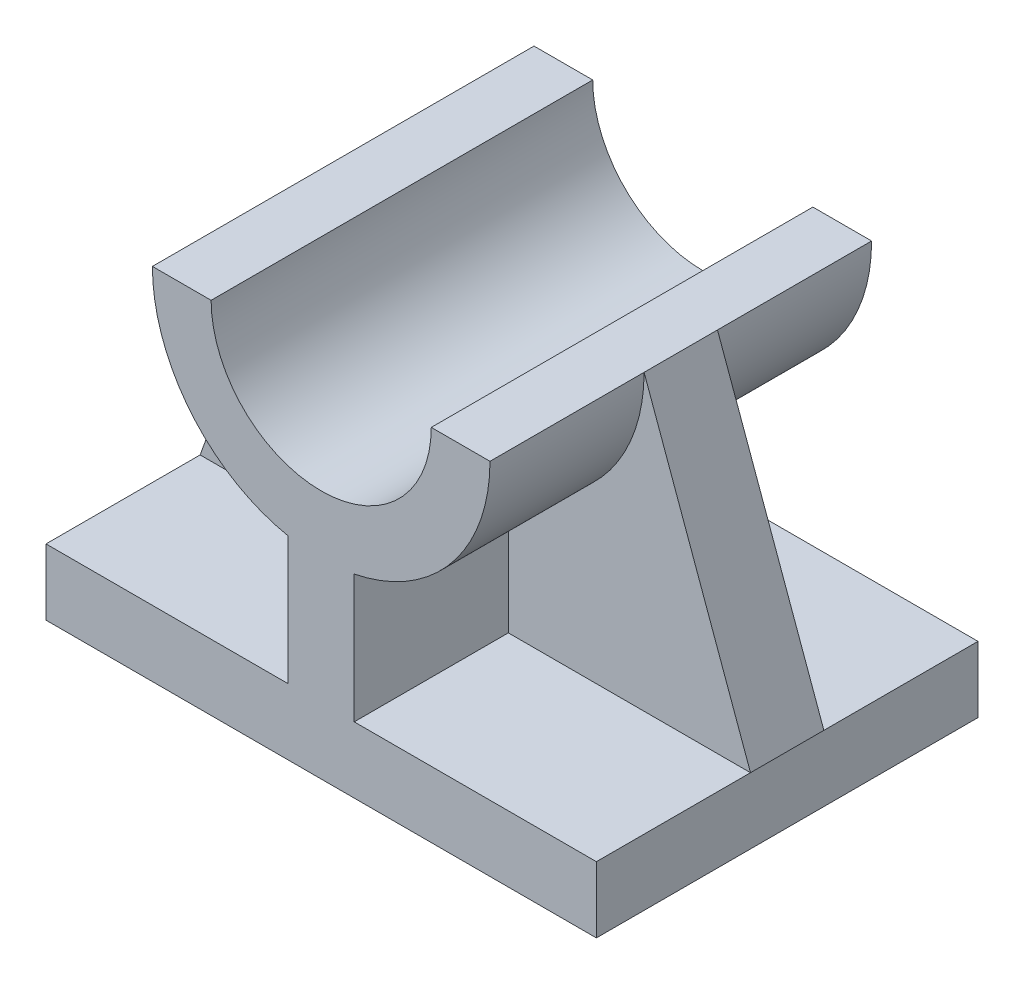
ISO-10303-21;
HEADER;
FILE_DESCRIPTION(('STEP AP214'),'2;1');
FILE_NAME('part.step','',(''),(''),'','','');
FILE_SCHEMA(('AUTOMOTIVE_DESIGN { 1 0 10303 214 1 1 1 1 }'));
ENDSEC;
DATA;
#1=APPLICATION_CONTEXT('core data for automotive mechanical design processes');
#2=APPLICATION_PROTOCOL_DEFINITION('international standard','automotive_design',2000,#1);
#3=PRODUCT_CONTEXT('',#1,'mechanical');
#4=PRODUCT('Part','Part','',(#3));
#5=PRODUCT_RELATED_PRODUCT_CATEGORY('part','',(#4));
#6=PRODUCT_DEFINITION_FORMATION('','',#4);
#7=PRODUCT_DEFINITION_CONTEXT('part definition',#1,'design');
#8=PRODUCT_DEFINITION('design','',#6,#7);
#9=PRODUCT_DEFINITION_SHAPE('','',#8);
#10=(LENGTH_UNIT() NAMED_UNIT(*) SI_UNIT(.MILLI.,.METRE.));
#11=(NAMED_UNIT(*) PLANE_ANGLE_UNIT() SI_UNIT($,.RADIAN.));
#12=(NAMED_UNIT(*) SI_UNIT($,.STERADIAN.) SOLID_ANGLE_UNIT());
#13=UNCERTAINTY_MEASURE_WITH_UNIT(LENGTH_MEASURE(1.E-05),#10,'distance_accuracy_value','');
#14=(GEOMETRIC_REPRESENTATION_CONTEXT(3) GLOBAL_UNCERTAINTY_ASSIGNED_CONTEXT((#13)) GLOBAL_UNIT_ASSIGNED_CONTEXT((#10,
#11,#12)) REPRESENTATION_CONTEXT('',''));
#15=CARTESIAN_POINT('',(0.,0.,0.));
#16=DIRECTION('',(0.,0.,1.));
#17=DIRECTION('',(1.,0.,0.));
#18=AXIS2_PLACEMENT_3D('',#15,#16,#17);
#19=CARTESIAN_POINT('',(0.,44.5,26.));
#20=DIRECTION('',(0.,0.,-1.));
#21=DIRECTION('',(-1.,0.,0.));
#22=AXIS2_PLACEMENT_3D('',#19,#20,#21);
#23=CYLINDRICAL_SURFACE('',#22,23.);
#24=CARTESIAN_POINT('',(0.,44.5,-5.));
#25=DIRECTION('',(0.,0.,1.));
#26=DIRECTION('',(1.,0.,0.));
#27=AXIS2_PLACEMENT_3D('',#24,#25,#26);
#28=CIRCLE('',#27,23.);
#29=CARTESIAN_POINT('',(-23.,44.5,-5.));
#30=VERTEX_POINT('',#29);
#31=CARTESIAN_POINT('',(-4.5,21.9445128627201,-5.));
#32=VERTEX_POINT('',#31);
#33=EDGE_CURVE('E194',#30,#32,#28,.T.);
#34=ORIENTED_EDGE('',*,*,#33,.F.);
#35=DIRECTION('',(0.,0.,-1.));
#36=VECTOR('',#35,1.);
#37=CARTESIAN_POINT('',(-23.,44.5,26.));
#38=LINE('',#37,#36);
#39=CARTESIAN_POINT('',(-23.,44.5,-26.));
#40=VERTEX_POINT('',#39);
#41=EDGE_CURVE('E204',#30,#40,#38,.T.);
#42=ORIENTED_EDGE('',*,*,#41,.T.);
#43=CARTESIAN_POINT('',(0.,44.5,-26.));
#44=DIRECTION('',(0.,0.,1.));
#45=DIRECTION('',(1.,0.,0.));
#46=AXIS2_PLACEMENT_3D('',#43,#44,#45);
#47=CIRCLE('',#46,23.);
#48=CARTESIAN_POINT('',(-4.5,21.9445128627201,-26.));
#49=VERTEX_POINT('',#48);
#50=EDGE_CURVE('E294',#40,#49,#47,.T.);
#51=ORIENTED_EDGE('',*,*,#50,.T.);
#52=DIRECTION('',(0.,0.,-1.));
#53=VECTOR('',#52,1.);
#54=CARTESIAN_POINT('',(-4.5,21.9445128627201,26.));
#55=LINE('',#54,#53);
#56=EDGE_CURVE('E206',#32,#49,#55,.T.);
#57=ORIENTED_EDGE('',*,*,#56,.F.);
#58=EDGE_LOOP('',(#34,#42,#51,#57));
#59=FACE_BOUND('',#58,.T.);
#60=ADVANCED_FACE('F43',(#59),#23,.T.);
#61=CARTESIAN_POINT('',(-4.5,21.9445128627201,26.));
#62=DIRECTION('',(1.,0.,0.));
#63=DIRECTION('',(0.,1.,0.));
#64=AXIS2_PLACEMENT_3D('',#61,#62,#63);
#65=PLANE('',#64);
#66=DIRECTION('',(0.,-1.,0.));
#67=VECTOR('',#66,1.);
#68=CARTESIAN_POINT('',(-4.5,21.9445128627201,-5.));
#69=LINE('',#68,#67);
#70=CARTESIAN_POINT('',(-4.5,4.5,-5.));
#71=VERTEX_POINT('',#70);
#72=EDGE_CURVE('E209',#32,#71,#69,.T.);
#73=ORIENTED_EDGE('',*,*,#72,.F.);
#74=ORIENTED_EDGE('',*,*,#56,.T.);
#75=DIRECTION('',(0.,-1.,0.));
#76=VECTOR('',#75,1.);
#77=CARTESIAN_POINT('',(-4.5,21.9445128627201,-26.));
#78=LINE('',#77,#76);
#79=CARTESIAN_POINT('',(-4.5,4.5,-26.));
#80=VERTEX_POINT('',#79);
#81=EDGE_CURVE('E297',#49,#80,#78,.T.);
#82=ORIENTED_EDGE('',*,*,#81,.T.);
#83=DIRECTION('',(0.,0.,-1.));
#84=VECTOR('',#83,1.);
#85=CARTESIAN_POINT('',(-4.5,4.5,26.));
#86=LINE('',#85,#84);
#87=EDGE_CURVE('E325',#71,#80,#86,.T.);
#88=ORIENTED_EDGE('',*,*,#87,.F.);
#89=EDGE_LOOP('',(#73,#74,#82,#88));
#90=FACE_BOUND('',#89,.T.);
#91=ADVANCED_FACE('F343',(#90),#65,.F.);
#92=CARTESIAN_POINT('',(-37.5,4.5,26.));
#93=DIRECTION('',(0.,-1.,0.));
#94=DIRECTION('',(0.,0.,-1.));
#95=AXIS2_PLACEMENT_3D('',#92,#93,#94);
#96=PLANE('',#95);
#97=DIRECTION('',(-1.,0.,0.));
#98=VECTOR('',#97,1.);
#99=CARTESIAN_POINT('',(-37.5,4.5,-5.));
#100=LINE('',#99,#98);
#101=CARTESIAN_POINT('',(-37.5,4.5,-4.99999999999999));
#102=VERTEX_POINT('',#101);
#103=EDGE_CURVE('E197',#71,#102,#100,.T.);
#104=ORIENTED_EDGE('',*,*,#103,.F.);
#105=ORIENTED_EDGE('',*,*,#87,.T.);
#106=DIRECTION('',(-1.,0.,0.));
#107=VECTOR('',#106,1.);
#108=CARTESIAN_POINT('',(-37.5,4.5,-26.));
#109=LINE('',#108,#107);
#110=CARTESIAN_POINT('',(-37.5,4.5,-26.));
#111=VERTEX_POINT('',#110);
#112=EDGE_CURVE('E301',#80,#111,#109,.T.);
#113=ORIENTED_EDGE('',*,*,#112,.T.);
#114=DIRECTION('',(0.,0.,-1.));
#115=VECTOR('',#114,1.);
#116=CARTESIAN_POINT('',(-37.5,4.5,26.));
#117=LINE('',#116,#115);
#118=EDGE_CURVE('E321',#102,#111,#117,.T.);
#119=ORIENTED_EDGE('',*,*,#118,.F.);
#120=EDGE_LOOP('',(#104,#105,#113,#119));
#121=FACE_BOUND('',#120,.T.);
#122=ADVANCED_FACE('F338',(#121),#96,.F.);
#123=CARTESIAN_POINT('',(4.5,4.5,26.));
#124=DIRECTION('',(0.,-1.,0.));
#125=DIRECTION('',(0.,0.,-1.));
#126=AXIS2_PLACEMENT_3D('',#123,#124,#125);
#127=PLANE('',#126);
#128=DIRECTION('',(-1.,0.,0.));
#129=VECTOR('',#128,1.);
#130=CARTESIAN_POINT('',(4.5,4.5,-5.));
#131=LINE('',#130,#129);
#132=CARTESIAN_POINT('',(37.5,4.5,-5.));
#133=VERTEX_POINT('',#132);
#134=CARTESIAN_POINT('',(4.5,4.5,-5.));
#135=VERTEX_POINT('',#134);
#136=EDGE_CURVE('E410',#133,#135,#131,.T.);
#137=ORIENTED_EDGE('',*,*,#136,.F.);
#138=DIRECTION('',(0.,0.,-1.));
#139=VECTOR('',#138,1.);
#140=CARTESIAN_POINT('',(37.5,4.5,26.));
#141=LINE('',#140,#139);
#142=CARTESIAN_POINT('',(37.5,4.5,-26.));
#143=VERTEX_POINT('',#142);
#144=EDGE_CURVE('E52',#133,#143,#141,.T.);
#145=ORIENTED_EDGE('',*,*,#144,.T.);
#146=DIRECTION('',(-1.,0.,0.));
#147=VECTOR('',#146,1.);
#148=CARTESIAN_POINT('',(4.5,4.5,-26.));
#149=LINE('',#148,#147);
#150=CARTESIAN_POINT('',(4.5,4.5,-26.));
#151=VERTEX_POINT('',#150);
#152=EDGE_CURVE('E265',#143,#151,#149,.T.);
#153=ORIENTED_EDGE('',*,*,#152,.T.);
#154=DIRECTION('',(0.,0.,-1.));
#155=VECTOR('',#154,1.);
#156=CARTESIAN_POINT('',(4.5,4.5,26.));
#157=LINE('',#156,#155);
#158=EDGE_CURVE('E241',#135,#151,#157,.T.);
#159=ORIENTED_EDGE('',*,*,#158,.F.);
#160=EDGE_LOOP('',(#137,#145,#153,#159));
#161=FACE_BOUND('',#160,.T.);
#162=ADVANCED_FACE('F266',(#161),#127,.F.);
#163=CARTESIAN_POINT('',(4.5,21.9445128627201,26.));
#164=DIRECTION('',(-1.,0.,0.));
#165=DIRECTION('',(0.,-1.,0.));
#166=AXIS2_PLACEMENT_3D('',#163,#164,#165);
#167=PLANE('',#166);
#168=DIRECTION('',(0.,1.,0.));
#169=VECTOR('',#168,1.);
#170=CARTESIAN_POINT('',(4.5,21.9445128627201,-5.));
#171=LINE('',#170,#169);
#172=CARTESIAN_POINT('',(4.50000000000001,21.9445128627201,-5.));
#173=VERTEX_POINT('',#172);
#174=EDGE_CURVE('E261',#135,#173,#171,.T.);
#175=ORIENTED_EDGE('',*,*,#174,.F.);
#176=ORIENTED_EDGE('',*,*,#158,.T.);
#177=DIRECTION('',(0.,1.,0.));
#178=VECTOR('',#177,1.);
#179=CARTESIAN_POINT('',(4.5,21.9445128627201,-26.));
#180=LINE('',#179,#178);
#181=CARTESIAN_POINT('',(4.50000000000001,21.9445128627201,-26.));
#182=VERTEX_POINT('',#181);
#183=EDGE_CURVE('E259',#151,#182,#180,.T.);
#184=ORIENTED_EDGE('',*,*,#183,.T.);
#185=DIRECTION('',(0.,0.,-1.));
#186=VECTOR('',#185,1.);
#187=CARTESIAN_POINT('',(4.50000000000001,21.9445128627201,26.));
#188=LINE('',#187,#186);
#189=EDGE_CURVE('E236',#173,#182,#188,.T.);
#190=ORIENTED_EDGE('',*,*,#189,.F.);
#191=EDGE_LOOP('',(#175,#176,#184,#190));
#192=FACE_BOUND('',#191,.T.);
#193=ADVANCED_FACE('F256',(#192),#167,.F.);
#194=CARTESIAN_POINT('',(0.,44.5,26.));
#195=DIRECTION('',(0.,0.,-1.));
#196=DIRECTION('',(-1.,0.,0.));
#197=AXIS2_PLACEMENT_3D('',#194,#195,#196);
#198=CYLINDRICAL_SURFACE('',#197,23.);
#199=CARTESIAN_POINT('',(0.,44.5,-5.));
#200=DIRECTION('',(0.,0.,1.));
#201=DIRECTION('',(1.,0.,0.));
#202=AXIS2_PLACEMENT_3D('',#199,#200,#201);
#203=CIRCLE('',#202,23.);
#204=CARTESIAN_POINT('',(23.,44.5,-4.99999999999999));
#205=VERTEX_POINT('',#204);
#206=EDGE_CURVE('E415',#173,#205,#203,.T.);
#207=ORIENTED_EDGE('',*,*,#206,.F.);
#208=ORIENTED_EDGE('',*,*,#189,.T.);
#209=CARTESIAN_POINT('',(0.,44.5,-26.));
#210=DIRECTION('',(0.,0.,1.));
#211=DIRECTION('',(1.,0.,0.));
#212=AXIS2_PLACEMENT_3D('',#209,#210,#211);
#213=CIRCLE('',#212,23.);
#214=CARTESIAN_POINT('',(23.,44.5,-26.));
#215=VERTEX_POINT('',#214);
#216=EDGE_CURVE('E277',#182,#215,#213,.T.);
#217=ORIENTED_EDGE('',*,*,#216,.T.);
#218=DIRECTION('',(0.,0.,-1.));
#219=VECTOR('',#218,1.);
#220=CARTESIAN_POINT('',(23.,44.5,26.));
#221=LINE('',#220,#219);
#222=EDGE_CURVE('E231',#205,#215,#221,.T.);
#223=ORIENTED_EDGE('',*,*,#222,.F.);
#224=EDGE_LOOP('',(#207,#208,#217,#223));
#225=FACE_BOUND('',#224,.T.);
#226=ADVANCED_FACE('F466',(#225),#198,.T.);
#227=CARTESIAN_POINT('',(37.5,4.5,26.));
#228=DIRECTION('',(-1.,0.,0.));
#229=DIRECTION('',(0.,0.,1.));
#230=AXIS2_PLACEMENT_3D('',#227,#228,#229);
#231=PLANE('',#230);
#232=DIRECTION('',(0.,0.,-1.));
#233=VECTOR('',#232,1.);
#234=CARTESIAN_POINT('',(37.5,-4.5,26.));
#235=LINE('',#234,#233);
#236=CARTESIAN_POINT('',(37.5,-4.5,26.));
#237=VERTEX_POINT('',#236);
#238=CARTESIAN_POINT('',(37.5,-4.5,-26.));
#239=VERTEX_POINT('',#238);
#240=EDGE_CURVE('E314',#237,#239,#235,.T.);
#241=ORIENTED_EDGE('',*,*,#240,.T.);
#242=DIRECTION('',(0.,1.,0.));
#243=VECTOR('',#242,1.);
#244=CARTESIAN_POINT('',(37.5,4.5,-26.));
#245=LINE('',#244,#243);
#246=EDGE_CURVE('E272',#239,#143,#245,.T.);
#247=ORIENTED_EDGE('',*,*,#246,.T.);
#248=ORIENTED_EDGE('',*,*,#144,.F.);
#249=DIRECTION('',(0.,0.,-1.));
#250=VECTOR('',#249,1.);
#251=CARTESIAN_POINT('',(37.5,4.5,26.));
#252=LINE('',#251,#250);
#253=CARTESIAN_POINT('',(37.5,4.5,5.));
#254=VERTEX_POINT('',#253);
#255=EDGE_CURVE('E392',#133,#254,#252,.F.);
#256=ORIENTED_EDGE('',*,*,#255,.T.);
#257=CARTESIAN_POINT('',(37.5,4.5,26.));
#258=VERTEX_POINT('',#257);
#259=EDGE_CURVE('E11',#258,#254,#141,.T.);
#260=ORIENTED_EDGE('',*,*,#259,.F.);
#261=DIRECTION('',(0.,1.,0.));
#262=VECTOR('',#261,1.);
#263=CARTESIAN_POINT('',(37.5,4.5,26.));
#264=LINE('',#263,#262);
#265=EDGE_CURVE('E313',#237,#258,#264,.T.);
#266=ORIENTED_EDGE('',*,*,#265,.F.);
#267=EDGE_LOOP('',(#241,#247,#248,#256,#260,#266));
#268=FACE_BOUND('',#267,.T.);
#269=ADVANCED_FACE('F45',(#268),#231,.F.);
#270=ORIENTED_EDGE('',*,*,#259,.T.);
#271=DIRECTION('',(-1.,0.,0.));
#272=VECTOR('',#271,1.);
#273=CARTESIAN_POINT('',(4.5,4.5,5.));
#274=LINE('',#273,#272);
#275=CARTESIAN_POINT('',(4.5,4.5,5.));
#276=VERTEX_POINT('',#275);
#277=EDGE_CURVE('E398',#254,#276,#274,.T.);
#278=ORIENTED_EDGE('',*,*,#277,.T.);
#279=CARTESIAN_POINT('',(4.5,4.5,26.));
#280=VERTEX_POINT('',#279);
#281=EDGE_CURVE('E242',#280,#276,#157,.T.);
#282=ORIENTED_EDGE('',*,*,#281,.F.);
#283=DIRECTION('',(-1.,0.,0.));
#284=VECTOR('',#283,1.);
#285=CARTESIAN_POINT('',(4.5,4.5,26.));
#286=LINE('',#285,#284);
#287=EDGE_CURVE('E382',#258,#280,#286,.T.);
#288=ORIENTED_EDGE('',*,*,#287,.F.);
#289=EDGE_LOOP('',(#270,#278,#282,#288));
#290=FACE_BOUND('',#289,.T.);
#291=ADVANCED_FACE('F472',(#290),#127,.F.);
#292=ORIENTED_EDGE('',*,*,#281,.T.);
#293=DIRECTION('',(0.,1.,0.));
#294=VECTOR('',#293,1.);
#295=CARTESIAN_POINT('',(4.5,21.9445128627201,5.));
#296=LINE('',#295,#294);
#297=CARTESIAN_POINT('',(4.50000000000001,21.9445128627201,5.));
#298=VERTEX_POINT('',#297);
#299=EDGE_CURVE('E401',#276,#298,#296,.T.);
#300=ORIENTED_EDGE('',*,*,#299,.T.);
#301=CARTESIAN_POINT('',(4.50000000000001,21.9445128627201,26.));
#302=VERTEX_POINT('',#301);
#303=EDGE_CURVE('E238',#302,#298,#188,.T.);
#304=ORIENTED_EDGE('',*,*,#303,.F.);
#305=DIRECTION('',(0.,1.,0.));
#306=VECTOR('',#305,1.);
#307=CARTESIAN_POINT('',(4.5,21.9445128627201,26.));
#308=LINE('',#307,#306);
#309=EDGE_CURVE('E379',#280,#302,#308,.T.);
#310=ORIENTED_EDGE('',*,*,#309,.F.);
#311=EDGE_LOOP('',(#292,#300,#304,#310));
#312=FACE_BOUND('',#311,.T.);
#313=ADVANCED_FACE('F477',(#312),#167,.F.);
#314=ORIENTED_EDGE('',*,*,#303,.T.);
#315=CARTESIAN_POINT('',(0.,44.5,5.));
#316=DIRECTION('',(0.,0.,1.));
#317=DIRECTION('',(1.,0.,0.));
#318=AXIS2_PLACEMENT_3D('',#315,#316,#317);
#319=CIRCLE('',#318,23.);
#320=CARTESIAN_POINT('',(23.,44.5,5.));
#321=VERTEX_POINT('',#320);
#322=EDGE_CURVE('E404',#298,#321,#319,.T.);
#323=ORIENTED_EDGE('',*,*,#322,.T.);
#324=CARTESIAN_POINT('',(23.,44.5,26.));
#325=VERTEX_POINT('',#324);
#326=EDGE_CURVE('E232',#325,#321,#221,.T.);
#327=ORIENTED_EDGE('',*,*,#326,.F.);
#328=CARTESIAN_POINT('',(0.,44.5,26.));
#329=DIRECTION('',(0.,0.,1.));
#330=DIRECTION('',(1.,0.,0.));
#331=AXIS2_PLACEMENT_3D('',#328,#329,#330);
#332=CIRCLE('',#331,23.);
#333=EDGE_CURVE('E376',#302,#325,#332,.T.);
#334=ORIENTED_EDGE('',*,*,#333,.F.);
#335=EDGE_LOOP('',(#314,#323,#327,#334));
#336=FACE_BOUND('',#335,.T.);
#337=ADVANCED_FACE('F479',(#336),#198,.T.);
#338=CARTESIAN_POINT('',(15.,44.5,26.));
#339=DIRECTION('',(0.,-1.,0.));
#340=DIRECTION('',(0.,0.,-1.));
#341=AXIS2_PLACEMENT_3D('',#338,#339,#340);
#342=PLANE('',#341);
#343=ORIENTED_EDGE('',*,*,#326,.T.);
#344=EDGE_CURVE('E237',#321,#205,#221,.T.);
#345=ORIENTED_EDGE('',*,*,#344,.T.);
#346=ORIENTED_EDGE('',*,*,#222,.T.);
#347=DIRECTION('',(-1.,0.,0.));
#348=VECTOR('',#347,1.);
#349=CARTESIAN_POINT('',(15.,44.5,-26.));
#350=LINE('',#349,#348);
#351=CARTESIAN_POINT('',(15.,44.5,-26.));
#352=VERTEX_POINT('',#351);
#353=EDGE_CURVE('E281',#215,#352,#350,.T.);
#354=ORIENTED_EDGE('',*,*,#353,.T.);
#355=DIRECTION('',(0.,0.,-1.));
#356=VECTOR('',#355,1.);
#357=CARTESIAN_POINT('',(15.,44.5,26.));
#358=LINE('',#357,#356);
#359=CARTESIAN_POINT('',(15.,44.5,26.));
#360=VERTEX_POINT('',#359);
#361=EDGE_CURVE('E228',#360,#352,#358,.T.);
#362=ORIENTED_EDGE('',*,*,#361,.F.);
#363=DIRECTION('',(-1.,0.,0.));
#364=VECTOR('',#363,1.);
#365=CARTESIAN_POINT('',(15.,44.5,26.));
#366=LINE('',#365,#364);
#367=EDGE_CURVE('E373',#325,#360,#366,.T.);
#368=ORIENTED_EDGE('',*,*,#367,.F.);
#369=EDGE_LOOP('',(#343,#345,#346,#354,#362,#368));
#370=FACE_BOUND('',#369,.T.);
#371=ADVANCED_FACE('F460',(#370),#342,.F.);
#372=CARTESIAN_POINT('',(0.,44.5,26.));
#373=DIRECTION('',(0.,0.,-1.));
#374=DIRECTION('',(-1.,0.,0.));
#375=AXIS2_PLACEMENT_3D('',#372,#373,#374);
#376=CYLINDRICAL_SURFACE('',#375,15.);
#377=ORIENTED_EDGE('',*,*,#361,.T.);
#378=CARTESIAN_POINT('',(0.,44.5,-26.));
#379=DIRECTION('',(0.,0.,-1.));
#380=DIRECTION('',(1.,0.,0.));
#381=AXIS2_PLACEMENT_3D('',#378,#379,#380);
#382=CIRCLE('',#381,15.);
#383=CARTESIAN_POINT('',(-15.,44.5,-26.));
#384=VERTEX_POINT('',#383);
#385=EDGE_CURVE('E288',#352,#384,#382,.T.);
#386=ORIENTED_EDGE('',*,*,#385,.T.);
#387=DIRECTION('',(0.,0.,-1.));
#388=VECTOR('',#387,1.);
#389=CARTESIAN_POINT('',(-15.,44.5,26.));
#390=LINE('',#389,#388);
#391=CARTESIAN_POINT('',(-15.,44.5,26.));
#392=VERTEX_POINT('',#391);
#393=EDGE_CURVE('E221',#392,#384,#390,.T.);
#394=ORIENTED_EDGE('',*,*,#393,.F.);
#395=CARTESIAN_POINT('',(0.,44.5,26.));
#396=DIRECTION('',(0.,0.,-1.));
#397=DIRECTION('',(1.,0.,0.));
#398=AXIS2_PLACEMENT_3D('',#395,#396,#397);
#399=CIRCLE('',#398,15.);
#400=EDGE_CURVE('E370',#360,#392,#399,.T.);
#401=ORIENTED_EDGE('',*,*,#400,.F.);
#402=EDGE_LOOP('',(#377,#386,#394,#401));
#403=FACE_BOUND('',#402,.T.);
#404=ADVANCED_FACE('F457',(#403),#376,.F.);
#405=CARTESIAN_POINT('',(-23.,44.5,26.));
#406=DIRECTION('',(0.,-1.,0.));
#407=DIRECTION('',(0.,0.,-1.));
#408=AXIS2_PLACEMENT_3D('',#405,#406,#407);
#409=PLANE('',#408);
#410=ORIENTED_EDGE('',*,*,#393,.T.);
#411=DIRECTION('',(-1.,0.,0.));
#412=VECTOR('',#411,1.);
#413=CARTESIAN_POINT('',(-23.,44.5,-26.));
#414=LINE('',#413,#412);
#415=EDGE_CURVE('E213',#384,#40,#414,.T.);
#416=ORIENTED_EDGE('',*,*,#415,.T.);
#417=ORIENTED_EDGE('',*,*,#41,.F.);
#418=DIRECTION('',(0.,0.,-1.));
#419=VECTOR('',#418,1.);
#420=CARTESIAN_POINT('',(-23.,44.5,26.));
#421=LINE('',#420,#419);
#422=CARTESIAN_POINT('',(-23.,44.5,5.));
#423=VERTEX_POINT('',#422);
#424=EDGE_CURVE('E180',#30,#423,#421,.F.);
#425=ORIENTED_EDGE('',*,*,#424,.T.);
#426=CARTESIAN_POINT('',(-23.,44.5,26.));
#427=VERTEX_POINT('',#426);
#428=EDGE_CURVE('E216',#427,#423,#38,.T.);
#429=ORIENTED_EDGE('',*,*,#428,.F.);
#430=DIRECTION('',(-1.,0.,0.));
#431=VECTOR('',#430,1.);
#432=CARTESIAN_POINT('',(-23.,44.5,26.));
#433=LINE('',#432,#431);
#434=EDGE_CURVE('E367',#392,#427,#433,.T.);
#435=ORIENTED_EDGE('',*,*,#434,.F.);
#436=EDGE_LOOP('',(#410,#416,#417,#425,#429,#435));
#437=FACE_BOUND('',#436,.T.);
#438=ADVANCED_FACE('F211',(#437),#409,.F.);
#439=ORIENTED_EDGE('',*,*,#428,.T.);
#440=CARTESIAN_POINT('',(0.,44.5,5.));
#441=DIRECTION('',(0.,0.,1.));
#442=DIRECTION('',(1.,0.,0.));
#443=AXIS2_PLACEMENT_3D('',#440,#441,#442);
#444=CIRCLE('',#443,23.);
#445=CARTESIAN_POINT('',(-4.5,21.9445128627201,5.));
#446=VERTEX_POINT('',#445);
#447=EDGE_CURVE('E208',#423,#446,#444,.T.);
#448=ORIENTED_EDGE('',*,*,#447,.T.);
#449=CARTESIAN_POINT('',(-4.5,21.9445128627201,26.));
#450=VERTEX_POINT('',#449);
#451=EDGE_CURVE('E217',#450,#446,#55,.T.);
#452=ORIENTED_EDGE('',*,*,#451,.F.);
#453=CARTESIAN_POINT('',(0.,44.5,26.));
#454=DIRECTION('',(0.,0.,1.));
#455=DIRECTION('',(1.,0.,0.));
#456=AXIS2_PLACEMENT_3D('',#453,#454,#455);
#457=CIRCLE('',#456,23.);
#458=EDGE_CURVE('E364',#427,#450,#457,.T.);
#459=ORIENTED_EDGE('',*,*,#458,.F.);
#460=EDGE_LOOP('',(#439,#448,#452,#459));
#461=FACE_BOUND('',#460,.T.);
#462=ADVANCED_FACE('F450',(#461),#23,.T.);
#463=ORIENTED_EDGE('',*,*,#451,.T.);
#464=DIRECTION('',(0.,-1.,0.));
#465=VECTOR('',#464,1.);
#466=CARTESIAN_POINT('',(-4.5,21.9445128627201,5.));
#467=LINE('',#466,#465);
#468=CARTESIAN_POINT('',(-4.5,4.5,5.));
#469=VERTEX_POINT('',#468);
#470=EDGE_CURVE('E426',#446,#469,#467,.T.);
#471=ORIENTED_EDGE('',*,*,#470,.T.);
#472=CARTESIAN_POINT('',(-4.5,4.5,26.));
#473=VERTEX_POINT('',#472);
#474=EDGE_CURVE('E327',#473,#469,#86,.T.);
#475=ORIENTED_EDGE('',*,*,#474,.F.);
#476=DIRECTION('',(0.,-1.,0.));
#477=VECTOR('',#476,1.);
#478=CARTESIAN_POINT('',(-4.5,21.9445128627201,26.));
#479=LINE('',#478,#477);
#480=EDGE_CURVE('E361',#450,#473,#479,.T.);
#481=ORIENTED_EDGE('',*,*,#480,.F.);
#482=EDGE_LOOP('',(#463,#471,#475,#481));
#483=FACE_BOUND('',#482,.T.);
#484=ADVANCED_FACE('F448',(#483),#65,.F.);
#485=ORIENTED_EDGE('',*,*,#474,.T.);
#486=DIRECTION('',(-1.,0.,0.));
#487=VECTOR('',#486,1.);
#488=CARTESIAN_POINT('',(-37.5,4.5,5.));
#489=LINE('',#488,#487);
#490=CARTESIAN_POINT('',(-37.5,4.49999999999998,5.));
#491=VERTEX_POINT('',#490);
#492=EDGE_CURVE('E189',#469,#491,#489,.T.);
#493=ORIENTED_EDGE('',*,*,#492,.T.);
#494=CARTESIAN_POINT('',(-37.5,4.5,26.));
#495=VERTEX_POINT('',#494);
#496=EDGE_CURVE('E322',#495,#491,#117,.T.);
#497=ORIENTED_EDGE('',*,*,#496,.F.);
#498=DIRECTION('',(-1.,0.,0.));
#499=VECTOR('',#498,1.);
#500=CARTESIAN_POINT('',(-37.5,4.5,26.));
#501=LINE('',#500,#499);
#502=EDGE_CURVE('E358',#473,#495,#501,.T.);
#503=ORIENTED_EDGE('',*,*,#502,.F.);
#504=EDGE_LOOP('',(#485,#493,#497,#503));
#505=FACE_BOUND('',#504,.T.);
#506=ADVANCED_FACE('F441',(#505),#96,.F.);
#507=CARTESIAN_POINT('',(-37.5,4.5,26.));
#508=DIRECTION('',(1.,0.,0.));
#509=DIRECTION('',(0.,0.,-1.));
#510=AXIS2_PLACEMENT_3D('',#507,#508,#509);
#511=PLANE('',#510);
#512=ORIENTED_EDGE('',*,*,#496,.T.);
#513=EDGE_CURVE('E326',#491,#102,#117,.T.);
#514=ORIENTED_EDGE('',*,*,#513,.T.);
#515=ORIENTED_EDGE('',*,*,#118,.T.);
#516=DIRECTION('',(0.,-1.,0.));
#517=VECTOR('',#516,1.);
#518=CARTESIAN_POINT('',(-37.5,4.5,-26.));
#519=LINE('',#518,#517);
#520=CARTESIAN_POINT('',(-37.5,-4.5,-26.));
#521=VERTEX_POINT('',#520);
#522=EDGE_CURVE('E305',#111,#521,#519,.T.);
#523=ORIENTED_EDGE('',*,*,#522,.T.);
#524=DIRECTION('',(0.,0.,-1.));
#525=VECTOR('',#524,1.);
#526=CARTESIAN_POINT('',(-37.5,-4.5,26.));
#527=LINE('',#526,#525);
#528=CARTESIAN_POINT('',(-37.5,-4.5,26.));
#529=VERTEX_POINT('',#528);
#530=EDGE_CURVE('E317',#529,#521,#527,.T.);
#531=ORIENTED_EDGE('',*,*,#530,.F.);
#532=DIRECTION('',(0.,-1.,0.));
#533=VECTOR('',#532,1.);
#534=CARTESIAN_POINT('',(-37.5,4.5,26.));
#535=LINE('',#534,#533);
#536=EDGE_CURVE('E355',#495,#529,#535,.T.);
#537=ORIENTED_EDGE('',*,*,#536,.F.);
#538=EDGE_LOOP('',(#512,#514,#515,#523,#531,#537));
#539=FACE_BOUND('',#538,.T.);
#540=ADVANCED_FACE('F347',(#539),#511,.F.);
#541=CARTESIAN_POINT('',(-37.5,-4.5,26.));
#542=DIRECTION('',(0.,1.,0.));
#543=DIRECTION('',(0.,0.,1.));
#544=AXIS2_PLACEMENT_3D('',#541,#542,#543);
#545=PLANE('',#544);
#546=ORIENTED_EDGE('',*,*,#530,.T.);
#547=DIRECTION('',(1.,0.,0.));
#548=VECTOR('',#547,1.);
#549=CARTESIAN_POINT('',(-37.5,-4.5,-26.));
#550=LINE('',#549,#548);
#551=EDGE_CURVE('E309',#521,#239,#550,.T.);
#552=ORIENTED_EDGE('',*,*,#551,.T.);
#553=ORIENTED_EDGE('',*,*,#240,.F.);
#554=DIRECTION('',(1.,0.,0.));
#555=VECTOR('',#554,1.);
#556=CARTESIAN_POINT('',(-37.5,-4.5,26.));
#557=LINE('',#556,#555);
#558=EDGE_CURVE('E318',#529,#237,#557,.T.);
#559=ORIENTED_EDGE('',*,*,#558,.F.);
#560=EDGE_LOOP('',(#546,#552,#553,#559));
#561=FACE_BOUND('',#560,.T.);
#562=ADVANCED_FACE('F519',(#561),#545,.F.);
#563=CARTESIAN_POINT('',(0.,44.5,26.));
#564=DIRECTION('',(0.,0.,1.));
#565=DIRECTION('',(1.,0.,0.));
#566=AXIS2_PLACEMENT_3D('',#563,#564,#565);
#567=PLANE('',#566);
#568=ORIENTED_EDGE('',*,*,#265,.T.);
#569=ORIENTED_EDGE('',*,*,#287,.T.);
#570=ORIENTED_EDGE('',*,*,#309,.T.);
#571=ORIENTED_EDGE('',*,*,#333,.T.);
#572=ORIENTED_EDGE('',*,*,#367,.T.);
#573=ORIENTED_EDGE('',*,*,#400,.T.);
#574=ORIENTED_EDGE('',*,*,#434,.T.);
#575=ORIENTED_EDGE('',*,*,#458,.T.);
#576=ORIENTED_EDGE('',*,*,#480,.T.);
#577=ORIENTED_EDGE('',*,*,#502,.T.);
#578=ORIENTED_EDGE('',*,*,#536,.T.);
#579=ORIENTED_EDGE('',*,*,#558,.T.);
#580=EDGE_LOOP('',(#568,#569,#570,#571,#572,#573,#574,#575,#576,#577,#578,#579));
#581=FACE_BOUND('',#580,.T.);
#582=ADVANCED_FACE('F442',(#581),#567,.T.);
#583=CARTESIAN_POINT('',(0.,44.5,-26.));
#584=DIRECTION('',(0.,0.,1.));
#585=DIRECTION('',(1.,0.,0.));
#586=AXIS2_PLACEMENT_3D('',#583,#584,#585);
#587=PLANE('',#586);
#588=ORIENTED_EDGE('',*,*,#246,.F.);
#589=ORIENTED_EDGE('',*,*,#551,.F.);
#590=ORIENTED_EDGE('',*,*,#522,.F.);
#591=ORIENTED_EDGE('',*,*,#112,.F.);
#592=ORIENTED_EDGE('',*,*,#81,.F.);
#593=ORIENTED_EDGE('',*,*,#50,.F.);
#594=ORIENTED_EDGE('',*,*,#415,.F.);
#595=ORIENTED_EDGE('',*,*,#385,.F.);
#596=ORIENTED_EDGE('',*,*,#353,.F.);
#597=ORIENTED_EDGE('',*,*,#216,.F.);
#598=ORIENTED_EDGE('',*,*,#183,.F.);
#599=ORIENTED_EDGE('',*,*,#152,.F.);
#600=EDGE_LOOP('',(#588,#589,#590,#591,#592,#593,#594,#595,#596,#597,#598,#599));
#601=FACE_BOUND('',#600,.T.);
#602=ADVANCED_FACE('F274',(#601),#587,.F.);
#603=CARTESIAN_POINT('',(23.,44.5,0.));
#604=DIRECTION('',(-0.940136065162483,-0.3407993236214,0.));
#605=DIRECTION('',(0.3407993236214,-0.940136065162483,0.));
#606=AXIS2_PLACEMENT_3D('',#603,#604,#605);
#607=PLANE('',#606);
#608=ORIENTED_EDGE('',*,*,#255,.F.);
#609=DIRECTION('',(0.3407993236214,-0.940136065162483,0.));
#610=VECTOR('',#609,1.);
#611=CARTESIAN_POINT('',(23.,44.5,-5.));
#612=LINE('',#611,#610);
#613=EDGE_CURVE('E67',#205,#133,#612,.T.);
#614=ORIENTED_EDGE('',*,*,#613,.F.);
#615=ORIENTED_EDGE('',*,*,#344,.F.);
#616=DIRECTION('',(0.3407993236214,-0.940136065162483,0.));
#617=VECTOR('',#616,1.);
#618=CARTESIAN_POINT('',(23.,44.5,5.));
#619=LINE('',#618,#617);
#620=EDGE_CURVE('E418',#321,#254,#619,.T.);
#621=ORIENTED_EDGE('',*,*,#620,.T.);
#622=EDGE_LOOP('',(#608,#614,#615,#621));
#623=FACE_BOUND('',#622,.T.);
#624=ADVANCED_FACE('F528',(#623),#607,.F.);
#625=CARTESIAN_POINT('',(0.,20.,5.));
#626=DIRECTION('',(0.,0.,1.));
#627=DIRECTION('',(1.,0.,0.));
#628=AXIS2_PLACEMENT_3D('',#625,#626,#627);
#629=PLANE('',#628);
#630=ORIENTED_EDGE('',*,*,#277,.F.);
#631=ORIENTED_EDGE('',*,*,#620,.F.);
#632=ORIENTED_EDGE('',*,*,#322,.F.);
#633=ORIENTED_EDGE('',*,*,#299,.F.);
#634=EDGE_LOOP('',(#630,#631,#632,#633));
#635=FACE_BOUND('',#634,.T.);
#636=ADVANCED_FACE('F533',(#635),#629,.T.);
#637=CARTESIAN_POINT('',(0.,20.,-5.));
#638=DIRECTION('',(0.,0.,1.));
#639=DIRECTION('',(1.,0.,0.));
#640=AXIS2_PLACEMENT_3D('',#637,#638,#639);
#641=PLANE('',#640);
#642=ORIENTED_EDGE('',*,*,#613,.T.);
#643=ORIENTED_EDGE('',*,*,#136,.T.);
#644=ORIENTED_EDGE('',*,*,#174,.T.);
#645=ORIENTED_EDGE('',*,*,#206,.T.);
#646=EDGE_LOOP('',(#642,#643,#644,#645));
#647=FACE_BOUND('',#646,.T.);
#648=ADVANCED_FACE('F470',(#647),#641,.F.);
#649=CARTESIAN_POINT('',(-23.,44.5,0.));
#650=DIRECTION('',(-0.940136065162483,0.3407993236214,0.));
#651=DIRECTION('',(-0.3407993236214,-0.940136065162483,0.));
#652=AXIS2_PLACEMENT_3D('',#649,#650,#651);
#653=PLANE('',#652);
#654=ORIENTED_EDGE('',*,*,#424,.F.);
#655=DIRECTION('',(-0.3407993236214,-0.940136065162483,0.));
#656=VECTOR('',#655,1.);
#657=CARTESIAN_POINT('',(-23.,44.5,-5.));
#658=LINE('',#657,#656);
#659=EDGE_CURVE('E59',#30,#102,#658,.T.);
#660=ORIENTED_EDGE('',*,*,#659,.T.);
#661=ORIENTED_EDGE('',*,*,#513,.F.);
#662=DIRECTION('',(-0.3407993236214,-0.940136065162483,0.));
#663=VECTOR('',#662,1.);
#664=CARTESIAN_POINT('',(-23.,44.5,5.));
#665=LINE('',#664,#663);
#666=EDGE_CURVE('E183',#423,#491,#665,.T.);
#667=ORIENTED_EDGE('',*,*,#666,.F.);
#668=EDGE_LOOP('',(#654,#660,#661,#667));
#669=FACE_BOUND('',#668,.T.);
#670=ADVANCED_FACE('F181',(#669),#653,.T.);
#671=CARTESIAN_POINT('',(0.,20.,5.));
#672=DIRECTION('',(0.,0.,1.));
#673=DIRECTION('',(1.,0.,0.));
#674=AXIS2_PLACEMENT_3D('',#671,#672,#673);
#675=PLANE('',#674);
#676=ORIENTED_EDGE('',*,*,#492,.F.);
#677=ORIENTED_EDGE('',*,*,#470,.F.);
#678=ORIENTED_EDGE('',*,*,#447,.F.);
#679=ORIENTED_EDGE('',*,*,#666,.T.);
#680=EDGE_LOOP('',(#676,#677,#678,#679));
#681=FACE_BOUND('',#680,.T.);
#682=ADVANCED_FACE('F439',(#681),#675,.T.);
#683=CARTESIAN_POINT('',(0.,20.,-5.));
#684=DIRECTION('',(0.,0.,1.));
#685=DIRECTION('',(1.,0.,0.));
#686=AXIS2_PLACEMENT_3D('',#683,#684,#685);
#687=PLANE('',#686);
#688=ORIENTED_EDGE('',*,*,#659,.F.);
#689=ORIENTED_EDGE('',*,*,#33,.T.);
#690=ORIENTED_EDGE('',*,*,#72,.T.);
#691=ORIENTED_EDGE('',*,*,#103,.T.);
#692=EDGE_LOOP('',(#688,#689,#690,#691));
#693=FACE_BOUND('',#692,.T.);
#694=ADVANCED_FACE('F193',(#693),#687,.F.);
#695=CLOSED_SHELL('',(#60,#91,#122,#162,#193,#226,#269,#291,#313,#337,#371,#404,#438,#462,#484,
#506,#540,#562,#582,#602,#624,#636,#648,#670,#682,#694));
#696=MANIFOLD_SOLID_BREP('B2',#695);
#697=ADVANCED_BREP_SHAPE_REPRESENTATION('',(#18,#696),#14);
#698=SHAPE_DEFINITION_REPRESENTATION(#9,#697);
ENDSEC;
END-ISO-10303-21;
